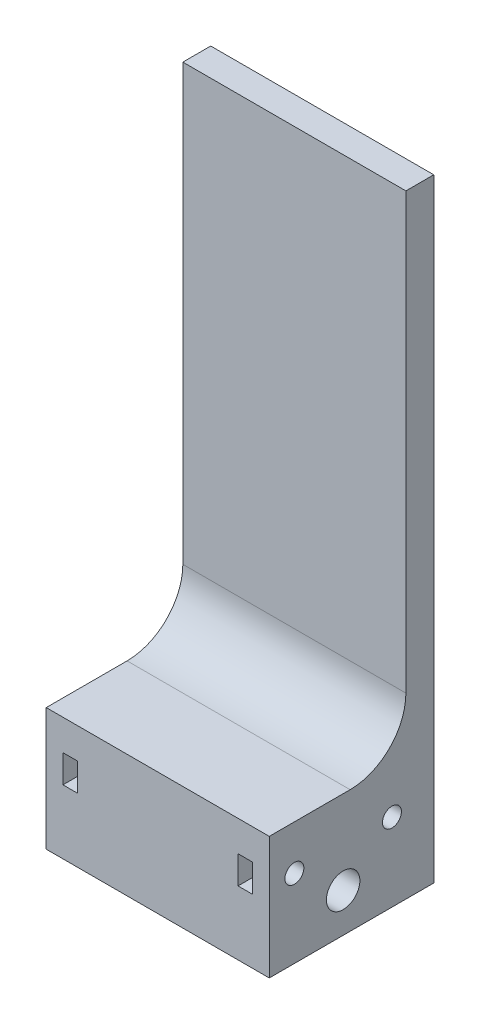
ISO-10303-21;
HEADER;
FILE_DESCRIPTION(('STEP AP214'),'2;1');
FILE_NAME('part.step','',(''),(''),'','','');
FILE_SCHEMA(('AUTOMOTIVE_DESIGN { 1 0 10303 214 1 1 1 1 }'));
ENDSEC;
DATA;
#1=APPLICATION_CONTEXT('core data for automotive mechanical design processes');
#2=APPLICATION_PROTOCOL_DEFINITION('international standard','automotive_design',2000,#1);
#3=PRODUCT_CONTEXT('',#1,'mechanical');
#4=PRODUCT('Part','Part','',(#3));
#5=PRODUCT_RELATED_PRODUCT_CATEGORY('part','',(#4));
#6=PRODUCT_DEFINITION_FORMATION('','',#4);
#7=PRODUCT_DEFINITION_CONTEXT('part definition',#1,'design');
#8=PRODUCT_DEFINITION('design','',#6,#7);
#9=PRODUCT_DEFINITION_SHAPE('','',#8);
#10=(LENGTH_UNIT() NAMED_UNIT(*) SI_UNIT(.MILLI.,.METRE.));
#11=(NAMED_UNIT(*) PLANE_ANGLE_UNIT() SI_UNIT($,.RADIAN.));
#12=(NAMED_UNIT(*) SI_UNIT($,.STERADIAN.) SOLID_ANGLE_UNIT());
#13=UNCERTAINTY_MEASURE_WITH_UNIT(LENGTH_MEASURE(1.E-05),#10,'distance_accuracy_value','');
#14=(GEOMETRIC_REPRESENTATION_CONTEXT(3) GLOBAL_UNCERTAINTY_ASSIGNED_CONTEXT((#13)) GLOBAL_UNIT_ASSIGNED_CONTEXT((#10,
#11,#12)) REPRESENTATION_CONTEXT('',''));
#15=CARTESIAN_POINT('',(0.,0.,0.));
#16=DIRECTION('',(0.,0.,1.));
#17=DIRECTION('',(1.,0.,0.));
#18=AXIS2_PLACEMENT_3D('',#15,#16,#17);
#19=CARTESIAN_POINT('',(-133.88700540448,31.,-20.));
#20=DIRECTION('',(1.,0.,0.));
#21=DIRECTION('',(0.,1.,0.));
#22=AXIS2_PLACEMENT_3D('',#19,#20,#21);
#23=CYLINDRICAL_SURFACE('',#22,1.7);
#24=CARTESIAN_POINT('',(-17.,31.,-20.));
#25=DIRECTION('',(-1.,0.,0.));
#26=DIRECTION('',(0.,0.,1.));
#27=AXIS2_PLACEMENT_3D('',#24,#25,#26);
#28=CIRCLE('',#27,1.7);
#29=CARTESIAN_POINT('',(-17.,31.,-18.3));
#30=VERTEX_POINT('',#29);
#31=EDGE_CURVE('E460',#30,#30,#28,.T.);
#32=ORIENTED_EDGE('',*,*,#31,.F.);
#33=EDGE_LOOP('',(#32));
#34=FACE_BOUND('',#33,.T.);
#35=CARTESIAN_POINT('',(-20.,31.,-20.));
#36=DIRECTION('',(1.,0.,0.));
#37=DIRECTION('',(0.,1.,0.));
#38=AXIS2_PLACEMENT_3D('',#35,#36,#37);
#39=CIRCLE('',#38,1.7);
#40=CARTESIAN_POINT('',(-20.,32.7,-20.));
#41=VERTEX_POINT('',#40);
#42=EDGE_CURVE('E372',#41,#41,#39,.T.);
#43=ORIENTED_EDGE('',*,*,#42,.F.);
#44=EDGE_LOOP('',(#43));
#45=FACE_BOUND('',#44,.T.);
#46=ADVANCED_FACE('F39',(#34,#45),#23,.F.);
#47=CARTESIAN_POINT('',(-133.88700540448,31.,-2.5));
#48=DIRECTION('',(1.,0.,0.));
#49=DIRECTION('',(0.,1.,0.));
#50=AXIS2_PLACEMENT_3D('',#47,#48,#49);
#51=CYLINDRICAL_SURFACE('',#50,1.7);
#52=CARTESIAN_POINT('',(17.,31.,-2.5));
#53=DIRECTION('',(1.,0.,0.));
#54=DIRECTION('',(0.,0.,-1.));
#55=AXIS2_PLACEMENT_3D('',#52,#53,#54);
#56=CIRCLE('',#55,1.7);
#57=CARTESIAN_POINT('',(17.,31.,-4.2));
#58=VERTEX_POINT('',#57);
#59=EDGE_CURVE('E451',#58,#58,#56,.T.);
#60=ORIENTED_EDGE('',*,*,#59,.F.);
#61=EDGE_LOOP('',(#60));
#62=FACE_BOUND('',#61,.T.);
#63=CARTESIAN_POINT('',(20.,31.,-2.5));
#64=DIRECTION('',(-1.,0.,0.));
#65=DIRECTION('',(0.,-1.,0.));
#66=AXIS2_PLACEMENT_3D('',#63,#64,#65);
#67=CIRCLE('',#66,1.7);
#68=CARTESIAN_POINT('',(20.,29.3,-2.5));
#69=VERTEX_POINT('',#68);
#70=EDGE_CURVE('E400',#69,#69,#67,.T.);
#71=ORIENTED_EDGE('',*,*,#70,.F.);
#72=EDGE_LOOP('',(#71));
#73=FACE_BOUND('',#72,.T.);
#74=ADVANCED_FACE('F495',(#62,#73),#51,.F.);
#75=CARTESIAN_POINT('',(20.,0.,0.));
#76=DIRECTION('',(-1.,0.,0.));
#77=DIRECTION('',(0.,-1.,0.));
#78=AXIS2_PLACEMENT_3D('',#75,#76,#77);
#79=PLANE('',#78);
#80=DIRECTION('',(0.,1.,0.));
#81=VECTOR('',#80,1.);
#82=CARTESIAN_POINT('',(20.,17.,2.));
#83=LINE('',#82,#81);
#84=CARTESIAN_POINT('',(20.,17.,2.));
#85=VERTEX_POINT('',#84);
#86=CARTESIAN_POINT('',(20.,39.,2.));
#87=VERTEX_POINT('',#86);
#88=EDGE_CURVE('E392',#85,#87,#83,.T.);
#89=ORIENTED_EDGE('',*,*,#88,.F.);
#90=DIRECTION('',(0.,0.,1.));
#91=VECTOR('',#90,1.);
#92=CARTESIAN_POINT('',(20.,17.,2.));
#93=LINE('',#92,#91);
#94=CARTESIAN_POINT('',(20.,17.,-27.5));
#95=VERTEX_POINT('',#94);
#96=EDGE_CURVE('E369',#95,#85,#93,.T.);
#97=ORIENTED_EDGE('',*,*,#96,.F.);
#98=DIRECTION('',(0.,-1.,0.));
#99=VECTOR('',#98,1.);
#100=CARTESIAN_POINT('',(20.,17.,-27.5));
#101=LINE('',#100,#99);
#102=CARTESIAN_POINT('',(20.,127.,-27.5));
#103=VERTEX_POINT('',#102);
#104=EDGE_CURVE('E374',#103,#95,#101,.T.);
#105=ORIENTED_EDGE('',*,*,#104,.F.);
#106=DIRECTION('',(0.,0.,-1.));
#107=VECTOR('',#106,1.);
#108=CARTESIAN_POINT('',(20.,127.,-22.5));
#109=LINE('',#108,#107);
#110=CARTESIAN_POINT('',(20.,127.,-22.5));
#111=VERTEX_POINT('',#110);
#112=EDGE_CURVE('E379',#111,#103,#109,.T.);
#113=ORIENTED_EDGE('',*,*,#112,.F.);
#114=DIRECTION('',(0.,1.,0.));
#115=VECTOR('',#114,1.);
#116=CARTESIAN_POINT('',(20.,127.,-22.5));
#117=LINE('',#116,#115);
#118=CARTESIAN_POINT('',(20.,49.,-22.5));
#119=VERTEX_POINT('',#118);
#120=EDGE_CURVE('E384',#119,#111,#117,.T.);
#121=ORIENTED_EDGE('',*,*,#120,.F.);
#122=CARTESIAN_POINT('',(20.,49.,-12.5));
#123=DIRECTION('',(-1.,0.,0.));
#124=DIRECTION('',(0.,-1.,0.));
#125=AXIS2_PLACEMENT_3D('',#122,#123,#124);
#126=CIRCLE('',#125,10.);
#127=CARTESIAN_POINT('',(20.,39.,-12.5));
#128=VERTEX_POINT('',#127);
#129=EDGE_CURVE('E48',#119,#128,#126,.T.);
#130=ORIENTED_EDGE('',*,*,#129,.T.);
#131=DIRECTION('',(0.,0.,-1.));
#132=VECTOR('',#131,1.);
#133=CARTESIAN_POINT('',(20.,39.,2.));
#134=LINE('',#133,#132);
#135=EDGE_CURVE('E388',#87,#128,#134,.T.);
#136=ORIENTED_EDGE('',*,*,#135,.F.);
#137=EDGE_LOOP('',(#89,#97,#105,#113,#121,#130,#136));
#138=FACE_BOUND('',#137,.T.);
#139=CARTESIAN_POINT('',(20.,24.,-11.25));
#140=DIRECTION('',(-1.,0.,0.));
#141=DIRECTION('',(0.,-1.,0.));
#142=AXIS2_PLACEMENT_3D('',#139,#140,#141);
#143=CIRCLE('',#142,3.);
#144=CARTESIAN_POINT('',(20.,21.,-11.25));
#145=VERTEX_POINT('',#144);
#146=EDGE_CURVE('E397',#145,#145,#143,.T.);
#147=ORIENTED_EDGE('',*,*,#146,.T.);
#148=EDGE_LOOP('',(#147));
#149=FACE_BOUND('',#148,.T.);
#150=ORIENTED_EDGE('',*,*,#70,.T.);
#151=EDGE_LOOP('',(#150));
#152=FACE_BOUND('',#151,.T.);
#153=CARTESIAN_POINT('',(20.,31.,-20.));
#154=DIRECTION('',(-1.,0.,0.));
#155=DIRECTION('',(0.,-1.,0.));
#156=AXIS2_PLACEMENT_3D('',#153,#154,#155);
#157=CIRCLE('',#156,1.7);
#158=CARTESIAN_POINT('',(20.,29.3,-20.));
#159=VERTEX_POINT('',#158);
#160=EDGE_CURVE('E404',#159,#159,#157,.T.);
#161=ORIENTED_EDGE('',*,*,#160,.T.);
#162=EDGE_LOOP('',(#161));
#163=FACE_BOUND('',#162,.T.);
#164=ADVANCED_FACE('F500',(#138,#149,#152,#163),#79,.F.);
#165=CARTESIAN_POINT('',(-133.88700540448,17.,2.));
#166=DIRECTION('',(0.,0.,-1.));
#167=DIRECTION('',(-1.,0.,0.));
#168=AXIS2_PLACEMENT_3D('',#165,#166,#167);
#169=PLANE('',#168);
#170=DIRECTION('',(1.,0.,0.));
#171=VECTOR('',#170,1.);
#172=CARTESIAN_POINT('',(14.4,28.5,2.));
#173=LINE('',#172,#171);
#174=CARTESIAN_POINT('',(14.4,28.5,2.));
#175=VERTEX_POINT('',#174);
#176=CARTESIAN_POINT('',(17.,28.5,2.));
#177=VERTEX_POINT('',#176);
#178=EDGE_CURVE('E309',#175,#177,#173,.T.);
#179=ORIENTED_EDGE('',*,*,#178,.F.);
#180=DIRECTION('',(0.,-1.,0.));
#181=VECTOR('',#180,1.);
#182=CARTESIAN_POINT('',(14.4,33.5,2.));
#183=LINE('',#182,#181);
#184=CARTESIAN_POINT('',(14.4,33.5,2.));
#185=VERTEX_POINT('',#184);
#186=EDGE_CURVE('E307',#185,#175,#183,.T.);
#187=ORIENTED_EDGE('',*,*,#186,.F.);
#188=DIRECTION('',(-1.,0.,0.));
#189=VECTOR('',#188,1.);
#190=CARTESIAN_POINT('',(14.4,33.5,2.));
#191=LINE('',#190,#189);
#192=CARTESIAN_POINT('',(17.,33.5,2.));
#193=VERTEX_POINT('',#192);
#194=EDGE_CURVE('E297',#193,#185,#191,.T.);
#195=ORIENTED_EDGE('',*,*,#194,.F.);
#196=DIRECTION('',(0.,1.,0.));
#197=VECTOR('',#196,1.);
#198=CARTESIAN_POINT('',(17.,33.5,2.));
#199=LINE('',#198,#197);
#200=EDGE_CURVE('E313',#177,#193,#199,.T.);
#201=ORIENTED_EDGE('',*,*,#200,.F.);
#202=EDGE_LOOP('',(#179,#187,#195,#201));
#203=FACE_BOUND('',#202,.T.);
#204=DIRECTION('',(-1.,0.,0.));
#205=VECTOR('',#204,1.);
#206=CARTESIAN_POINT('',(-14.4,33.5,2.));
#207=LINE('',#206,#205);
#208=CARTESIAN_POINT('',(-14.4,33.5,2.));
#209=VERTEX_POINT('',#208);
#210=CARTESIAN_POINT('',(-17.,33.5,2.));
#211=VERTEX_POINT('',#210);
#212=EDGE_CURVE('E348',#209,#211,#207,.T.);
#213=ORIENTED_EDGE('',*,*,#212,.F.);
#214=DIRECTION('',(0.,1.,0.));
#215=VECTOR('',#214,1.);
#216=CARTESIAN_POINT('',(-14.4,33.5,2.));
#217=LINE('',#216,#215);
#218=CARTESIAN_POINT('',(-14.4,28.5,2.));
#219=VERTEX_POINT('',#218);
#220=EDGE_CURVE('E345',#219,#209,#217,.T.);
#221=ORIENTED_EDGE('',*,*,#220,.F.);
#222=DIRECTION('',(1.,0.,0.));
#223=VECTOR('',#222,1.);
#224=CARTESIAN_POINT('',(-14.4,28.5,2.));
#225=LINE('',#224,#223);
#226=CARTESIAN_POINT('',(-17.,28.5,2.));
#227=VERTEX_POINT('',#226);
#228=EDGE_CURVE('E332',#227,#219,#225,.T.);
#229=ORIENTED_EDGE('',*,*,#228,.F.);
#230=DIRECTION('',(0.,-1.,0.));
#231=VECTOR('',#230,1.);
#232=CARTESIAN_POINT('',(-17.,33.5,2.));
#233=LINE('',#232,#231);
#234=EDGE_CURVE('E352',#211,#227,#233,.T.);
#235=ORIENTED_EDGE('',*,*,#234,.F.);
#236=EDGE_LOOP('',(#213,#221,#229,#235));
#237=FACE_BOUND('',#236,.T.);
#238=DIRECTION('',(1.,0.,0.));
#239=VECTOR('',#238,1.);
#240=CARTESIAN_POINT('',(-133.88700540448,39.,2.));
#241=LINE('',#240,#239);
#242=CARTESIAN_POINT('',(-20.,39.,2.));
#243=VERTEX_POINT('',#242);
#244=EDGE_CURVE('E391',#243,#87,#241,.T.);
#245=ORIENTED_EDGE('',*,*,#244,.F.);
#246=DIRECTION('',(0.,-1.,0.));
#247=VECTOR('',#246,1.);
#248=CARTESIAN_POINT('',(-20.,17.,2.));
#249=LINE('',#248,#247);
#250=CARTESIAN_POINT('',(-20.,17.,2.));
#251=VERTEX_POINT('',#250);
#252=EDGE_CURVE('E407',#243,#251,#249,.T.);
#253=ORIENTED_EDGE('',*,*,#252,.T.);
#254=DIRECTION('',(1.,0.,0.));
#255=VECTOR('',#254,1.);
#256=CARTESIAN_POINT('',(-133.88700540448,17.,2.));
#257=LINE('',#256,#255);
#258=EDGE_CURVE('E396',#251,#85,#257,.T.);
#259=ORIENTED_EDGE('',*,*,#258,.T.);
#260=ORIENTED_EDGE('',*,*,#88,.T.);
#261=EDGE_LOOP('',(#245,#253,#259,#260));
#262=FACE_BOUND('',#261,.T.);
#263=ADVANCED_FACE('F521',(#203,#237,#262),#169,.F.);
#264=CARTESIAN_POINT('',(-133.88700540448,39.,2.));
#265=DIRECTION('',(0.,-1.,0.));
#266=DIRECTION('',(1.,0.,0.));
#267=AXIS2_PLACEMENT_3D('',#264,#265,#266);
#268=PLANE('',#267);
#269=ORIENTED_EDGE('',*,*,#135,.T.);
#270=DIRECTION('',(1.,0.,0.));
#271=VECTOR('',#270,1.);
#272=CARTESIAN_POINT('',(-20.,39.,-12.5));
#273=LINE('',#272,#271);
#274=CARTESIAN_POINT('',(-20.,39.,-12.5));
#275=VERTEX_POINT('',#274);
#276=EDGE_CURVE('E441',#128,#275,#273,.F.);
#277=ORIENTED_EDGE('',*,*,#276,.T.);
#278=DIRECTION('',(0.,0.,1.));
#279=VECTOR('',#278,1.);
#280=CARTESIAN_POINT('',(-20.,39.,2.));
#281=LINE('',#280,#279);
#282=EDGE_CURVE('E395',#275,#243,#281,.T.);
#283=ORIENTED_EDGE('',*,*,#282,.T.);
#284=ORIENTED_EDGE('',*,*,#244,.T.);
#285=EDGE_LOOP('',(#269,#277,#283,#284));
#286=FACE_BOUND('',#285,.T.);
#287=ADVANCED_FACE('F527',(#286),#268,.F.);
#288=CARTESIAN_POINT('',(-133.88700540448,127.,-22.5));
#289=DIRECTION('',(0.,0.,-1.));
#290=DIRECTION('',(0.,1.,0.));
#291=AXIS2_PLACEMENT_3D('',#288,#289,#290);
#292=PLANE('',#291);
#293=DIRECTION('',(0.,-1.,0.));
#294=VECTOR('',#293,1.);
#295=CARTESIAN_POINT('',(-20.,127.,-22.5));
#296=LINE('',#295,#294);
#297=CARTESIAN_POINT('',(-20.,127.,-22.5));
#298=VERTEX_POINT('',#297);
#299=CARTESIAN_POINT('',(-20.,49.,-22.5));
#300=VERTEX_POINT('',#299);
#301=EDGE_CURVE('E387',#298,#300,#296,.T.);
#302=ORIENTED_EDGE('',*,*,#301,.T.);
#303=DIRECTION('',(1.,0.,0.));
#304=VECTOR('',#303,1.);
#305=CARTESIAN_POINT('',(20.,49.,-22.5));
#306=LINE('',#305,#304);
#307=EDGE_CURVE('E431',#300,#119,#306,.T.);
#308=ORIENTED_EDGE('',*,*,#307,.T.);
#309=ORIENTED_EDGE('',*,*,#120,.T.);
#310=DIRECTION('',(1.,0.,0.));
#311=VECTOR('',#310,1.);
#312=CARTESIAN_POINT('',(-133.88700540448,127.,-22.5));
#313=LINE('',#312,#311);
#314=EDGE_CURVE('E383',#298,#111,#313,.T.);
#315=ORIENTED_EDGE('',*,*,#314,.F.);
#316=EDGE_LOOP('',(#302,#308,#309,#315));
#317=FACE_BOUND('',#316,.T.);
#318=ADVANCED_FACE('F550',(#317),#292,.F.);
#319=CARTESIAN_POINT('',(-133.88700540448,127.,-22.5));
#320=DIRECTION('',(0.,-1.,0.));
#321=DIRECTION('',(1.,0.,0.));
#322=AXIS2_PLACEMENT_3D('',#319,#320,#321);
#323=PLANE('',#322);
#324=DIRECTION('',(1.,0.,0.));
#325=VECTOR('',#324,1.);
#326=CARTESIAN_POINT('',(-133.88700540448,127.,-27.5));
#327=LINE('',#326,#325);
#328=CARTESIAN_POINT('',(-20.,127.,-27.5));
#329=VERTEX_POINT('',#328);
#330=EDGE_CURVE('E378',#329,#103,#327,.T.);
#331=ORIENTED_EDGE('',*,*,#330,.F.);
#332=DIRECTION('',(0.,0.,1.));
#333=VECTOR('',#332,1.);
#334=CARTESIAN_POINT('',(-20.,127.,-22.5));
#335=LINE('',#334,#333);
#336=EDGE_CURVE('E386',#329,#298,#335,.T.);
#337=ORIENTED_EDGE('',*,*,#336,.T.);
#338=ORIENTED_EDGE('',*,*,#314,.T.);
#339=ORIENTED_EDGE('',*,*,#112,.T.);
#340=EDGE_LOOP('',(#331,#337,#338,#339));
#341=FACE_BOUND('',#340,.T.);
#342=ADVANCED_FACE('F546',(#341),#323,.F.);
#343=CARTESIAN_POINT('',(-133.88700540448,17.,-27.5));
#344=DIRECTION('',(0.,0.,1.));
#345=DIRECTION('',(0.,-1.,0.));
#346=AXIS2_PLACEMENT_3D('',#343,#344,#345);
#347=PLANE('',#346);
#348=DIRECTION('',(-1.,0.,0.));
#349=VECTOR('',#348,1.);
#350=CARTESIAN_POINT('',(-14.4,28.5,-27.5));
#351=LINE('',#350,#349);
#352=CARTESIAN_POINT('',(-14.4,28.5,-27.5));
#353=VERTEX_POINT('',#352);
#354=CARTESIAN_POINT('',(-17.,28.5,-27.5));
#355=VERTEX_POINT('',#354);
#356=EDGE_CURVE('E248',#353,#355,#351,.T.);
#357=ORIENTED_EDGE('',*,*,#356,.F.);
#358=DIRECTION('',(0.,-1.,0.));
#359=VECTOR('',#358,1.);
#360=CARTESIAN_POINT('',(-14.4,33.5,-27.5));
#361=LINE('',#360,#359);
#362=CARTESIAN_POINT('',(-14.4,33.5,-27.5));
#363=VERTEX_POINT('',#362);
#364=EDGE_CURVE('E59',#363,#353,#361,.T.);
#365=ORIENTED_EDGE('',*,*,#364,.F.);
#366=DIRECTION('',(1.,0.,0.));
#367=VECTOR('',#366,1.);
#368=CARTESIAN_POINT('',(-17.,33.5,-27.5));
#369=LINE('',#368,#367);
#370=CARTESIAN_POINT('',(-17.,33.5,-27.5));
#371=VERTEX_POINT('',#370);
#372=EDGE_CURVE('E234',#371,#363,#369,.T.);
#373=ORIENTED_EDGE('',*,*,#372,.F.);
#374=DIRECTION('',(0.,1.,0.));
#375=VECTOR('',#374,1.);
#376=CARTESIAN_POINT('',(-17.,28.5,-27.5));
#377=LINE('',#376,#375);
#378=EDGE_CURVE('E239',#355,#371,#377,.T.);
#379=ORIENTED_EDGE('',*,*,#378,.F.);
#380=EDGE_LOOP('',(#357,#365,#373,#379));
#381=FACE_BOUND('',#380,.T.);
#382=DIRECTION('',(1.,0.,0.));
#383=VECTOR('',#382,1.);
#384=CARTESIAN_POINT('',(14.4,33.5,-27.5));
#385=LINE('',#384,#383);
#386=CARTESIAN_POINT('',(14.4,33.5,-27.5));
#387=VERTEX_POINT('',#386);
#388=CARTESIAN_POINT('',(17.,33.5,-27.5));
#389=VERTEX_POINT('',#388);
#390=EDGE_CURVE('E279',#387,#389,#385,.T.);
#391=ORIENTED_EDGE('',*,*,#390,.F.);
#392=DIRECTION('',(0.,1.,0.));
#393=VECTOR('',#392,1.);
#394=CARTESIAN_POINT('',(14.4,28.5,-27.5));
#395=LINE('',#394,#393);
#396=CARTESIAN_POINT('',(14.4,28.5,-27.5));
#397=VERTEX_POINT('',#396);
#398=EDGE_CURVE('E67',#397,#387,#395,.T.);
#399=ORIENTED_EDGE('',*,*,#398,.F.);
#400=DIRECTION('',(-1.,0.,0.));
#401=VECTOR('',#400,1.);
#402=CARTESIAN_POINT('',(17.,28.5,-27.5));
#403=LINE('',#402,#401);
#404=CARTESIAN_POINT('',(17.,28.5,-27.5));
#405=VERTEX_POINT('',#404);
#406=EDGE_CURVE('E268',#405,#397,#403,.T.);
#407=ORIENTED_EDGE('',*,*,#406,.F.);
#408=DIRECTION('',(0.,-1.,0.));
#409=VECTOR('',#408,1.);
#410=CARTESIAN_POINT('',(17.,33.5,-27.5));
#411=LINE('',#410,#409);
#412=EDGE_CURVE('E282',#389,#405,#411,.T.);
#413=ORIENTED_EDGE('',*,*,#412,.F.);
#414=EDGE_LOOP('',(#391,#399,#407,#413));
#415=FACE_BOUND('',#414,.T.);
#416=DIRECTION('',(1.,0.,0.));
#417=VECTOR('',#416,1.);
#418=CARTESIAN_POINT('',(-133.88700540448,17.,-27.5));
#419=LINE('',#418,#417);
#420=CARTESIAN_POINT('',(-20.,17.,-27.5));
#421=VERTEX_POINT('',#420);
#422=EDGE_CURVE('E373',#421,#95,#419,.T.);
#423=ORIENTED_EDGE('',*,*,#422,.F.);
#424=DIRECTION('',(0.,1.,0.));
#425=VECTOR('',#424,1.);
#426=CARTESIAN_POINT('',(-20.,17.,-27.5));
#427=LINE('',#426,#425);
#428=EDGE_CURVE('E382',#421,#329,#427,.T.);
#429=ORIENTED_EDGE('',*,*,#428,.T.);
#430=ORIENTED_EDGE('',*,*,#330,.T.);
#431=ORIENTED_EDGE('',*,*,#104,.T.);
#432=EDGE_LOOP('',(#423,#429,#430,#431));
#433=FACE_BOUND('',#432,.T.);
#434=ADVANCED_FACE('F542',(#381,#415,#433),#347,.F.);
#435=CARTESIAN_POINT('',(-133.88700540448,17.,2.));
#436=DIRECTION('',(0.,1.,0.));
#437=DIRECTION('',(-1.,0.,0.));
#438=AXIS2_PLACEMENT_3D('',#435,#436,#437);
#439=PLANE('',#438);
#440=ORIENTED_EDGE('',*,*,#258,.F.);
#441=DIRECTION('',(0.,0.,-1.));
#442=VECTOR('',#441,1.);
#443=CARTESIAN_POINT('',(-20.,17.,2.));
#444=LINE('',#443,#442);
#445=EDGE_CURVE('E377',#251,#421,#444,.T.);
#446=ORIENTED_EDGE('',*,*,#445,.T.);
#447=ORIENTED_EDGE('',*,*,#422,.T.);
#448=ORIENTED_EDGE('',*,*,#96,.T.);
#449=EDGE_LOOP('',(#440,#446,#447,#448));
#450=FACE_BOUND('',#449,.T.);
#451=ADVANCED_FACE('F538',(#450),#439,.F.);
#452=CARTESIAN_POINT('',(-133.88700540448,24.,-11.25));
#453=DIRECTION('',(1.,0.,0.));
#454=DIRECTION('',(0.,1.,0.));
#455=AXIS2_PLACEMENT_3D('',#452,#453,#454);
#456=CYLINDRICAL_SURFACE('',#455,3.);
#457=CARTESIAN_POINT('',(-20.,24.,-11.25));
#458=DIRECTION('',(1.,0.,0.));
#459=DIRECTION('',(0.,1.,0.));
#460=AXIS2_PLACEMENT_3D('',#457,#458,#459);
#461=CIRCLE('',#460,3.);
#462=CARTESIAN_POINT('',(-20.,27.,-11.25));
#463=VERTEX_POINT('',#462);
#464=EDGE_CURVE('E427',#463,#463,#461,.T.);
#465=ORIENTED_EDGE('',*,*,#464,.F.);
#466=EDGE_LOOP('',(#465));
#467=FACE_BOUND('',#466,.T.);
#468=ORIENTED_EDGE('',*,*,#146,.F.);
#469=EDGE_LOOP('',(#468));
#470=FACE_BOUND('',#469,.T.);
#471=ADVANCED_FACE('F514',(#467,#470),#456,.F.);
#472=CARTESIAN_POINT('',(-17.,31.,-2.5));
#473=DIRECTION('',(-1.,0.,0.));
#474=DIRECTION('',(0.,0.,1.));
#475=AXIS2_PLACEMENT_3D('',#472,#473,#474);
#476=CIRCLE('',#475,1.7);
#477=CARTESIAN_POINT('',(-17.,31.,-0.799999999999996));
#478=VERTEX_POINT('',#477);
#479=EDGE_CURVE('E320',#478,#478,#476,.T.);
#480=ORIENTED_EDGE('',*,*,#479,.F.);
#481=EDGE_LOOP('',(#480));
#482=FACE_BOUND('',#481,.T.);
#483=CARTESIAN_POINT('',(-20.,31.,-2.5));
#484=DIRECTION('',(1.,0.,0.));
#485=DIRECTION('',(0.,1.,0.));
#486=AXIS2_PLACEMENT_3D('',#483,#484,#485);
#487=CIRCLE('',#486,1.7);
#488=CARTESIAN_POINT('',(-20.,32.7,-2.5));
#489=VERTEX_POINT('',#488);
#490=EDGE_CURVE('E432',#489,#489,#487,.T.);
#491=ORIENTED_EDGE('',*,*,#490,.F.);
#492=EDGE_LOOP('',(#491));
#493=FACE_BOUND('',#492,.T.);
#494=ADVANCED_FACE('F503',(#482,#493),#51,.F.);
#495=CARTESIAN_POINT('',(17.,31.,-20.));
#496=DIRECTION('',(1.,0.,0.));
#497=DIRECTION('',(0.,0.,-1.));
#498=AXIS2_PLACEMENT_3D('',#495,#496,#497);
#499=CIRCLE('',#498,1.7);
#500=CARTESIAN_POINT('',(17.,31.,-21.7));
#501=VERTEX_POINT('',#500);
#502=EDGE_CURVE('E258',#501,#501,#499,.T.);
#503=ORIENTED_EDGE('',*,*,#502,.F.);
#504=EDGE_LOOP('',(#503));
#505=FACE_BOUND('',#504,.T.);
#506=ORIENTED_EDGE('',*,*,#160,.F.);
#507=EDGE_LOOP('',(#506));
#508=FACE_BOUND('',#507,.T.);
#509=ADVANCED_FACE('F475',(#505,#508),#23,.F.);
#510=CARTESIAN_POINT('',(-20.,37.,-11.25));
#511=DIRECTION('',(1.,0.,0.));
#512=DIRECTION('',(0.,0.,1.));
#513=AXIS2_PLACEMENT_3D('',#510,#511,#512);
#514=PLANE('',#513);
#515=ORIENTED_EDGE('',*,*,#42,.T.);
#516=EDGE_LOOP('',(#515));
#517=FACE_BOUND('',#516,.T.);
#518=ORIENTED_EDGE('',*,*,#490,.T.);
#519=EDGE_LOOP('',(#518));
#520=FACE_BOUND('',#519,.T.);
#521=ORIENTED_EDGE('',*,*,#464,.T.);
#522=EDGE_LOOP('',(#521));
#523=FACE_BOUND('',#522,.T.);
#524=ORIENTED_EDGE('',*,*,#282,.F.);
#525=CARTESIAN_POINT('',(-20.,49.,-12.5));
#526=DIRECTION('',(1.,0.,0.));
#527=DIRECTION('',(0.,1.,0.));
#528=AXIS2_PLACEMENT_3D('',#525,#526,#527);
#529=CIRCLE('',#528,10.);
#530=EDGE_CURVE('E11',#275,#300,#529,.T.);
#531=ORIENTED_EDGE('',*,*,#530,.T.);
#532=ORIENTED_EDGE('',*,*,#301,.F.);
#533=ORIENTED_EDGE('',*,*,#336,.F.);
#534=ORIENTED_EDGE('',*,*,#428,.F.);
#535=ORIENTED_EDGE('',*,*,#445,.F.);
#536=ORIENTED_EDGE('',*,*,#252,.F.);
#537=EDGE_LOOP('',(#524,#531,#532,#533,#534,#535,#536));
#538=FACE_BOUND('',#537,.T.);
#539=ADVANCED_FACE('F507',(#517,#520,#523,#538),#514,.F.);
#540=CARTESIAN_POINT('',(-133.88700540448,49.,-12.5));
#541=DIRECTION('',(-1.,0.,0.));
#542=DIRECTION('',(0.,-1.,0.));
#543=AXIS2_PLACEMENT_3D('',#540,#541,#542);
#544=CYLINDRICAL_SURFACE('',#543,10.);
#545=ORIENTED_EDGE('',*,*,#530,.F.);
#546=ORIENTED_EDGE('',*,*,#276,.F.);
#547=ORIENTED_EDGE('',*,*,#129,.F.);
#548=ORIENTED_EDGE('',*,*,#307,.F.);
#549=EDGE_LOOP('',(#545,#546,#547,#548));
#550=FACE_BOUND('',#549,.T.);
#551=ADVANCED_FACE('F41',(#550),#544,.F.);
#552=CARTESIAN_POINT('',(-14.4,33.5,-5.));
#553=DIRECTION('',(1.,0.,0.));
#554=DIRECTION('',(0.,0.,-1.));
#555=AXIS2_PLACEMENT_3D('',#552,#553,#554);
#556=PLANE('',#555);
#557=CARTESIAN_POINT('',(-14.4,31.,-2.5));
#558=DIRECTION('',(1.,0.,0.));
#559=DIRECTION('',(0.,0.,-1.));
#560=AXIS2_PLACEMENT_3D('',#557,#558,#559);
#561=CIRCLE('',#560,1.7);
#562=CARTESIAN_POINT('',(-14.4,31.,-4.2));
#563=VERTEX_POINT('',#562);
#564=EDGE_CURVE('E447',#563,#563,#561,.T.);
#565=ORIENTED_EDGE('',*,*,#564,.T.);
#566=EDGE_LOOP('',(#565));
#567=FACE_BOUND('',#566,.T.);
#568=ORIENTED_EDGE('',*,*,#220,.T.);
#569=DIRECTION('',(0.,0.,1.));
#570=VECTOR('',#569,1.);
#571=CARTESIAN_POINT('',(-14.4,33.5,-5.));
#572=LINE('',#571,#570);
#573=CARTESIAN_POINT('',(-14.4,33.5,-5.));
#574=VERTEX_POINT('',#573);
#575=EDGE_CURVE('E344',#574,#209,#572,.T.);
#576=ORIENTED_EDGE('',*,*,#575,.F.);
#577=DIRECTION('',(0.,1.,0.));
#578=VECTOR('',#577,1.);
#579=CARTESIAN_POINT('',(-14.4,33.5,-5.));
#580=LINE('',#579,#578);
#581=CARTESIAN_POINT('',(-14.4,28.5,-5.));
#582=VERTEX_POINT('',#581);
#583=EDGE_CURVE('E327',#582,#574,#580,.T.);
#584=ORIENTED_EDGE('',*,*,#583,.F.);
#585=DIRECTION('',(0.,0.,1.));
#586=VECTOR('',#585,1.);
#587=CARTESIAN_POINT('',(-14.4,28.5,-5.));
#588=LINE('',#587,#586);
#589=EDGE_CURVE('E310',#582,#219,#588,.T.);
#590=ORIENTED_EDGE('',*,*,#589,.T.);
#591=EDGE_LOOP('',(#568,#576,#584,#590));
#592=FACE_BOUND('',#591,.T.);
#593=ADVANCED_FACE('F534',(#567,#592),#556,.F.);
#594=CARTESIAN_POINT('',(-14.4,28.5,-5.));
#595=DIRECTION('',(0.,-1.,0.));
#596=DIRECTION('',(0.,0.,-1.));
#597=AXIS2_PLACEMENT_3D('',#594,#595,#596);
#598=PLANE('',#597);
#599=ORIENTED_EDGE('',*,*,#228,.T.);
#600=ORIENTED_EDGE('',*,*,#589,.F.);
#601=DIRECTION('',(1.,0.,0.));
#602=VECTOR('',#601,1.);
#603=CARTESIAN_POINT('',(-14.4,28.5,-5.));
#604=LINE('',#603,#602);
#605=CARTESIAN_POINT('',(-17.,28.5,-5.));
#606=VERTEX_POINT('',#605);
#607=EDGE_CURVE('E340',#606,#582,#604,.T.);
#608=ORIENTED_EDGE('',*,*,#607,.F.);
#609=DIRECTION('',(0.,0.,1.));
#610=VECTOR('',#609,1.);
#611=CARTESIAN_POINT('',(-17.,28.5,-5.));
#612=LINE('',#611,#610);
#613=EDGE_CURVE('E361',#606,#227,#612,.T.);
#614=ORIENTED_EDGE('',*,*,#613,.T.);
#615=EDGE_LOOP('',(#599,#600,#608,#614));
#616=FACE_BOUND('',#615,.T.);
#617=ADVANCED_FACE('F582',(#616),#598,.F.);
#618=CARTESIAN_POINT('',(-17.,33.5,-5.));
#619=DIRECTION('',(-1.,0.,0.));
#620=DIRECTION('',(0.,0.,1.));
#621=AXIS2_PLACEMENT_3D('',#618,#619,#620);
#622=PLANE('',#621);
#623=ORIENTED_EDGE('',*,*,#479,.T.);
#624=EDGE_LOOP('',(#623));
#625=FACE_BOUND('',#624,.T.);
#626=ORIENTED_EDGE('',*,*,#234,.T.);
#627=ORIENTED_EDGE('',*,*,#613,.F.);
#628=DIRECTION('',(0.,-1.,0.));
#629=VECTOR('',#628,1.);
#630=CARTESIAN_POINT('',(-17.,33.5,-5.));
#631=LINE('',#630,#629);
#632=CARTESIAN_POINT('',(-17.,33.5,-5.));
#633=VERTEX_POINT('',#632);
#634=EDGE_CURVE('E336',#633,#606,#631,.T.);
#635=ORIENTED_EDGE('',*,*,#634,.F.);
#636=DIRECTION('',(0.,0.,1.));
#637=VECTOR('',#636,1.);
#638=CARTESIAN_POINT('',(-17.,33.5,-5.));
#639=LINE('',#638,#637);
#640=EDGE_CURVE('E363',#633,#211,#639,.T.);
#641=ORIENTED_EDGE('',*,*,#640,.T.);
#642=EDGE_LOOP('',(#626,#627,#635,#641));
#643=FACE_BOUND('',#642,.T.);
#644=ADVANCED_FACE('F587',(#625,#643),#622,.F.);
#645=CARTESIAN_POINT('',(-14.4,33.5,-5.));
#646=DIRECTION('',(0.,1.,0.));
#647=DIRECTION('',(0.,0.,1.));
#648=AXIS2_PLACEMENT_3D('',#645,#646,#647);
#649=PLANE('',#648);
#650=ORIENTED_EDGE('',*,*,#212,.T.);
#651=ORIENTED_EDGE('',*,*,#640,.F.);
#652=DIRECTION('',(-1.,0.,0.));
#653=VECTOR('',#652,1.);
#654=CARTESIAN_POINT('',(-14.4,33.5,-5.));
#655=LINE('',#654,#653);
#656=EDGE_CURVE('E331',#574,#633,#655,.T.);
#657=ORIENTED_EDGE('',*,*,#656,.F.);
#658=ORIENTED_EDGE('',*,*,#575,.T.);
#659=EDGE_LOOP('',(#650,#651,#657,#658));
#660=FACE_BOUND('',#659,.T.);
#661=ADVANCED_FACE('F599',(#660),#649,.F.);
#662=CARTESIAN_POINT('',(0.,0.,-5.));
#663=DIRECTION('',(0.,0.,-1.));
#664=DIRECTION('',(-1.,0.,0.));
#665=AXIS2_PLACEMENT_3D('',#662,#663,#664);
#666=PLANE('',#665);
#667=ORIENTED_EDGE('',*,*,#583,.T.);
#668=ORIENTED_EDGE('',*,*,#656,.T.);
#669=ORIENTED_EDGE('',*,*,#634,.T.);
#670=ORIENTED_EDGE('',*,*,#607,.T.);
#671=EDGE_LOOP('',(#667,#668,#669,#670));
#672=FACE_BOUND('',#671,.T.);
#673=ADVANCED_FACE('F605',(#672),#666,.F.);
#674=CARTESIAN_POINT('',(14.4,31.,-2.5));
#675=DIRECTION('',(-1.,0.,0.));
#676=DIRECTION('',(0.,0.,1.));
#677=AXIS2_PLACEMENT_3D('',#674,#675,#676);
#678=CIRCLE('',#677,1.7);
#679=CARTESIAN_POINT('',(14.4,31.,-0.799999999999996));
#680=VERTEX_POINT('',#679);
#681=EDGE_CURVE('E401',#680,#680,#678,.T.);
#682=ORIENTED_EDGE('',*,*,#681,.F.);
#683=EDGE_LOOP('',(#682));
#684=FACE_BOUND('',#683,.T.);
#685=ORIENTED_EDGE('',*,*,#564,.F.);
#686=EDGE_LOOP('',(#685));
#687=FACE_BOUND('',#686,.T.);
#688=ADVANCED_FACE('F504',(#684,#687),#51,.F.);
#689=CARTESIAN_POINT('',(14.4,33.5,-5.));
#690=DIRECTION('',(-1.,0.,0.));
#691=DIRECTION('',(0.,0.,1.));
#692=AXIS2_PLACEMENT_3D('',#689,#690,#691);
#693=PLANE('',#692);
#694=ORIENTED_EDGE('',*,*,#681,.T.);
#695=EDGE_LOOP('',(#694));
#696=FACE_BOUND('',#695,.T.);
#697=ORIENTED_EDGE('',*,*,#186,.T.);
#698=DIRECTION('',(0.,0.,1.));
#699=VECTOR('',#698,1.);
#700=CARTESIAN_POINT('',(14.4,28.5,-5.));
#701=LINE('',#700,#699);
#702=CARTESIAN_POINT('',(14.4,28.5,-5.));
#703=VERTEX_POINT('',#702);
#704=EDGE_CURVE('E306',#703,#175,#701,.T.);
#705=ORIENTED_EDGE('',*,*,#704,.F.);
#706=DIRECTION('',(0.,-1.,0.));
#707=VECTOR('',#706,1.);
#708=CARTESIAN_POINT('',(14.4,33.5,-5.));
#709=LINE('',#708,#707);
#710=CARTESIAN_POINT('',(14.4,33.5,-5.));
#711=VERTEX_POINT('',#710);
#712=EDGE_CURVE('E293',#711,#703,#709,.T.);
#713=ORIENTED_EDGE('',*,*,#712,.F.);
#714=DIRECTION('',(0.,0.,1.));
#715=VECTOR('',#714,1.);
#716=CARTESIAN_POINT('',(14.4,33.5,-5.));
#717=LINE('',#716,#715);
#718=EDGE_CURVE('E318',#711,#185,#717,.T.);
#719=ORIENTED_EDGE('',*,*,#718,.T.);
#720=EDGE_LOOP('',(#697,#705,#713,#719));
#721=FACE_BOUND('',#720,.T.);
#722=ADVANCED_FACE('F612',(#696,#721),#693,.F.);
#723=CARTESIAN_POINT('',(14.4,33.5,-5.));
#724=DIRECTION('',(0.,1.,0.));
#725=DIRECTION('',(-1.,0.,0.));
#726=AXIS2_PLACEMENT_3D('',#723,#724,#725);
#727=PLANE('',#726);
#728=ORIENTED_EDGE('',*,*,#194,.T.);
#729=ORIENTED_EDGE('',*,*,#718,.F.);
#730=DIRECTION('',(-1.,0.,0.));
#731=VECTOR('',#730,1.);
#732=CARTESIAN_POINT('',(14.4,33.5,-5.));
#733=LINE('',#732,#731);
#734=CARTESIAN_POINT('',(17.,33.5,-5.));
#735=VERTEX_POINT('',#734);
#736=EDGE_CURVE('E303',#735,#711,#733,.T.);
#737=ORIENTED_EDGE('',*,*,#736,.F.);
#738=DIRECTION('',(0.,0.,1.));
#739=VECTOR('',#738,1.);
#740=CARTESIAN_POINT('',(17.,33.5,-5.));
#741=LINE('',#740,#739);
#742=EDGE_CURVE('E321',#735,#193,#741,.T.);
#743=ORIENTED_EDGE('',*,*,#742,.T.);
#744=EDGE_LOOP('',(#728,#729,#737,#743));
#745=FACE_BOUND('',#744,.T.);
#746=ADVANCED_FACE('F661',(#745),#727,.F.);
#747=CARTESIAN_POINT('',(17.,33.5,-5.));
#748=DIRECTION('',(1.,0.,0.));
#749=DIRECTION('',(0.,0.,-1.));
#750=AXIS2_PLACEMENT_3D('',#747,#748,#749);
#751=PLANE('',#750);
#752=ORIENTED_EDGE('',*,*,#59,.T.);
#753=EDGE_LOOP('',(#752));
#754=FACE_BOUND('',#753,.T.);
#755=ORIENTED_EDGE('',*,*,#200,.T.);
#756=ORIENTED_EDGE('',*,*,#742,.F.);
#757=DIRECTION('',(0.,1.,0.));
#758=VECTOR('',#757,1.);
#759=CARTESIAN_POINT('',(17.,33.5,-5.));
#760=LINE('',#759,#758);
#761=CARTESIAN_POINT('',(17.,28.5,-5.));
#762=VERTEX_POINT('',#761);
#763=EDGE_CURVE('E300',#762,#735,#760,.T.);
#764=ORIENTED_EDGE('',*,*,#763,.F.);
#765=DIRECTION('',(0.,0.,1.));
#766=VECTOR('',#765,1.);
#767=CARTESIAN_POINT('',(17.,28.5,-5.));
#768=LINE('',#767,#766);
#769=EDGE_CURVE('E323',#762,#177,#768,.T.);
#770=ORIENTED_EDGE('',*,*,#769,.T.);
#771=EDGE_LOOP('',(#755,#756,#764,#770));
#772=FACE_BOUND('',#771,.T.);
#773=ADVANCED_FACE('F670',(#754,#772),#751,.F.);
#774=CARTESIAN_POINT('',(14.4,28.5,-5.));
#775=DIRECTION('',(0.,-1.,0.));
#776=DIRECTION('',(1.,0.,0.));
#777=AXIS2_PLACEMENT_3D('',#774,#775,#776);
#778=PLANE('',#777);
#779=ORIENTED_EDGE('',*,*,#178,.T.);
#780=ORIENTED_EDGE('',*,*,#769,.F.);
#781=DIRECTION('',(1.,0.,0.));
#782=VECTOR('',#781,1.);
#783=CARTESIAN_POINT('',(14.4,28.5,-5.));
#784=LINE('',#783,#782);
#785=EDGE_CURVE('E296',#703,#762,#784,.T.);
#786=ORIENTED_EDGE('',*,*,#785,.F.);
#787=ORIENTED_EDGE('',*,*,#704,.T.);
#788=EDGE_LOOP('',(#779,#780,#786,#787));
#789=FACE_BOUND('',#788,.T.);
#790=ADVANCED_FACE('F490',(#789),#778,.F.);
#791=CARTESIAN_POINT('',(0.,0.,-5.));
#792=DIRECTION('',(0.,0.,1.));
#793=DIRECTION('',(1.,0.,0.));
#794=AXIS2_PLACEMENT_3D('',#791,#792,#793);
#795=PLANE('',#794);
#796=ORIENTED_EDGE('',*,*,#712,.T.);
#797=ORIENTED_EDGE('',*,*,#785,.T.);
#798=ORIENTED_EDGE('',*,*,#763,.T.);
#799=ORIENTED_EDGE('',*,*,#736,.T.);
#800=EDGE_LOOP('',(#796,#797,#798,#799));
#801=FACE_BOUND('',#800,.T.);
#802=ADVANCED_FACE('F481',(#801),#795,.T.);
#803=CARTESIAN_POINT('',(14.4,28.5,-16.5));
#804=DIRECTION('',(-1.,0.,0.));
#805=DIRECTION('',(0.,0.,1.));
#806=AXIS2_PLACEMENT_3D('',#803,#804,#805);
#807=PLANE('',#806);
#808=CARTESIAN_POINT('',(14.4,31.,-20.));
#809=DIRECTION('',(-1.,0.,0.));
#810=DIRECTION('',(0.,0.,1.));
#811=AXIS2_PLACEMENT_3D('',#808,#809,#810);
#812=CIRCLE('',#811,1.7);
#813=CARTESIAN_POINT('',(14.4,31.,-18.3));
#814=VERTEX_POINT('',#813);
#815=EDGE_CURVE('E458',#814,#814,#812,.T.);
#816=ORIENTED_EDGE('',*,*,#815,.T.);
#817=EDGE_LOOP('',(#816));
#818=FACE_BOUND('',#817,.T.);
#819=ORIENTED_EDGE('',*,*,#398,.T.);
#820=DIRECTION('',(0.,0.,-1.));
#821=VECTOR('',#820,1.);
#822=CARTESIAN_POINT('',(14.4,33.5,-16.5));
#823=LINE('',#822,#821);
#824=CARTESIAN_POINT('',(14.4,33.5,-16.5));
#825=VERTEX_POINT('',#824);
#826=EDGE_CURVE('E277',#825,#387,#823,.T.);
#827=ORIENTED_EDGE('',*,*,#826,.F.);
#828=DIRECTION('',(0.,1.,0.));
#829=VECTOR('',#828,1.);
#830=CARTESIAN_POINT('',(14.4,28.5,-16.5));
#831=LINE('',#830,#829);
#832=CARTESIAN_POINT('',(14.4,28.5,-16.5));
#833=VERTEX_POINT('',#832);
#834=EDGE_CURVE('E264',#833,#825,#831,.T.);
#835=ORIENTED_EDGE('',*,*,#834,.F.);
#836=DIRECTION('',(0.,0.,-1.));
#837=VECTOR('',#836,1.);
#838=CARTESIAN_POINT('',(14.4,28.5,-16.5));
#839=LINE('',#838,#837);
#840=EDGE_CURVE('E249',#833,#397,#839,.T.);
#841=ORIENTED_EDGE('',*,*,#840,.T.);
#842=EDGE_LOOP('',(#819,#827,#835,#841));
#843=FACE_BOUND('',#842,.T.);
#844=ADVANCED_FACE('F478',(#818,#843),#807,.F.);
#845=CARTESIAN_POINT('',(17.,28.5,-16.5));
#846=DIRECTION('',(0.,-1.,0.));
#847=DIRECTION('',(1.,0.,0.));
#848=AXIS2_PLACEMENT_3D('',#845,#846,#847);
#849=PLANE('',#848);
#850=ORIENTED_EDGE('',*,*,#406,.T.);
#851=ORIENTED_EDGE('',*,*,#840,.F.);
#852=DIRECTION('',(-1.,0.,0.));
#853=VECTOR('',#852,1.);
#854=CARTESIAN_POINT('',(17.,28.5,-16.5));
#855=LINE('',#854,#853);
#856=CARTESIAN_POINT('',(17.,28.5,-16.5));
#857=VERTEX_POINT('',#856);
#858=EDGE_CURVE('E274',#857,#833,#855,.T.);
#859=ORIENTED_EDGE('',*,*,#858,.F.);
#860=DIRECTION('',(0.,0.,-1.));
#861=VECTOR('',#860,1.);
#862=CARTESIAN_POINT('',(17.,28.5,-16.5));
#863=LINE('',#862,#861);
#864=EDGE_CURVE('E288',#857,#405,#863,.T.);
#865=ORIENTED_EDGE('',*,*,#864,.T.);
#866=EDGE_LOOP('',(#850,#851,#859,#865));
#867=FACE_BOUND('',#866,.T.);
#868=ADVANCED_FACE('F480',(#867),#849,.F.);
#869=CARTESIAN_POINT('',(17.,33.5,-16.5));
#870=DIRECTION('',(1.,0.,0.));
#871=DIRECTION('',(0.,0.,-1.));
#872=AXIS2_PLACEMENT_3D('',#869,#870,#871);
#873=PLANE('',#872);
#874=ORIENTED_EDGE('',*,*,#502,.T.);
#875=EDGE_LOOP('',(#874));
#876=FACE_BOUND('',#875,.T.);
#877=ORIENTED_EDGE('',*,*,#412,.T.);
#878=ORIENTED_EDGE('',*,*,#864,.F.);
#879=DIRECTION('',(0.,-1.,0.));
#880=VECTOR('',#879,1.);
#881=CARTESIAN_POINT('',(17.,33.5,-16.5));
#882=LINE('',#881,#880);
#883=CARTESIAN_POINT('',(17.,33.5,-16.5));
#884=VERTEX_POINT('',#883);
#885=EDGE_CURVE('E271',#884,#857,#882,.T.);
#886=ORIENTED_EDGE('',*,*,#885,.F.);
#887=DIRECTION('',(0.,0.,-1.));
#888=VECTOR('',#887,1.);
#889=CARTESIAN_POINT('',(17.,33.5,-16.5));
#890=LINE('',#889,#888);
#891=EDGE_CURVE('E290',#884,#389,#890,.T.);
#892=ORIENTED_EDGE('',*,*,#891,.T.);
#893=EDGE_LOOP('',(#877,#878,#886,#892));
#894=FACE_BOUND('',#893,.T.);
#895=ADVANCED_FACE('F487',(#876,#894),#873,.F.);
#896=CARTESIAN_POINT('',(14.4,33.5,-16.5));
#897=DIRECTION('',(0.,1.,0.));
#898=DIRECTION('',(-1.,0.,0.));
#899=AXIS2_PLACEMENT_3D('',#896,#897,#898);
#900=PLANE('',#899);
#901=ORIENTED_EDGE('',*,*,#390,.T.);
#902=ORIENTED_EDGE('',*,*,#891,.F.);
#903=DIRECTION('',(1.,0.,0.));
#904=VECTOR('',#903,1.);
#905=CARTESIAN_POINT('',(14.4,33.5,-16.5));
#906=LINE('',#905,#904);
#907=EDGE_CURVE('E267',#825,#884,#906,.T.);
#908=ORIENTED_EDGE('',*,*,#907,.F.);
#909=ORIENTED_EDGE('',*,*,#826,.T.);
#910=EDGE_LOOP('',(#901,#902,#908,#909));
#911=FACE_BOUND('',#910,.T.);
#912=ADVANCED_FACE('F733',(#911),#900,.F.);
#913=CARTESIAN_POINT('',(0.,0.,-16.5));
#914=DIRECTION('',(0.,0.,-1.));
#915=DIRECTION('',(-1.,0.,0.));
#916=AXIS2_PLACEMENT_3D('',#913,#914,#915);
#917=PLANE('',#916);
#918=ORIENTED_EDGE('',*,*,#834,.T.);
#919=ORIENTED_EDGE('',*,*,#907,.T.);
#920=ORIENTED_EDGE('',*,*,#885,.T.);
#921=ORIENTED_EDGE('',*,*,#858,.T.);
#922=EDGE_LOOP('',(#918,#919,#920,#921));
#923=FACE_BOUND('',#922,.T.);
#924=ADVANCED_FACE('F473',(#923),#917,.T.);
#925=CARTESIAN_POINT('',(-14.4,31.,-20.));
#926=DIRECTION('',(1.,0.,0.));
#927=DIRECTION('',(0.,0.,-1.));
#928=AXIS2_PLACEMENT_3D('',#925,#926,#927);
#929=CIRCLE('',#928,1.7);
#930=CARTESIAN_POINT('',(-14.4,31.,-21.7));
#931=VERTEX_POINT('',#930);
#932=EDGE_CURVE('E43',#931,#931,#929,.T.);
#933=ORIENTED_EDGE('',*,*,#932,.F.);
#934=EDGE_LOOP('',(#933));
#935=FACE_BOUND('',#934,.T.);
#936=ORIENTED_EDGE('',*,*,#815,.F.);
#937=EDGE_LOOP('',(#936));
#938=FACE_BOUND('',#937,.T.);
#939=ADVANCED_FACE('F470',(#935,#938),#23,.F.);
#940=CARTESIAN_POINT('',(-14.4,33.5,-16.5));
#941=DIRECTION('',(1.,0.,0.));
#942=DIRECTION('',(0.,0.,-1.));
#943=AXIS2_PLACEMENT_3D('',#940,#941,#942);
#944=PLANE('',#943);
#945=ORIENTED_EDGE('',*,*,#932,.T.);
#946=EDGE_LOOP('',(#945));
#947=FACE_BOUND('',#946,.T.);
#948=ORIENTED_EDGE('',*,*,#364,.T.);
#949=DIRECTION('',(0.,0.,-1.));
#950=VECTOR('',#949,1.);
#951=CARTESIAN_POINT('',(-14.4,28.5,-16.5));
#952=LINE('',#951,#950);
#953=CARTESIAN_POINT('',(-14.4,28.5,-16.5));
#954=VERTEX_POINT('',#953);
#955=EDGE_CURVE('E209',#954,#353,#952,.T.);
#956=ORIENTED_EDGE('',*,*,#955,.F.);
#957=DIRECTION('',(0.,-1.,0.));
#958=VECTOR('',#957,1.);
#959=CARTESIAN_POINT('',(-14.4,33.5,-16.5));
#960=LINE('',#959,#958);
#961=CARTESIAN_POINT('',(-14.4,33.5,-16.5));
#962=VERTEX_POINT('',#961);
#963=EDGE_CURVE('E213',#962,#954,#960,.T.);
#964=ORIENTED_EDGE('',*,*,#963,.F.);
#965=DIRECTION('',(0.,0.,-1.));
#966=VECTOR('',#965,1.);
#967=CARTESIAN_POINT('',(-14.4,33.5,-16.5));
#968=LINE('',#967,#966);
#969=EDGE_CURVE('E255',#962,#363,#968,.T.);
#970=ORIENTED_EDGE('',*,*,#969,.T.);
#971=EDGE_LOOP('',(#948,#956,#964,#970));
#972=FACE_BOUND('',#971,.T.);
#973=ADVANCED_FACE('F211',(#947,#972),#944,.F.);
#974=CARTESIAN_POINT('',(-17.,33.5,-16.5));
#975=DIRECTION('',(0.,1.,0.));
#976=DIRECTION('',(0.,0.,1.));
#977=AXIS2_PLACEMENT_3D('',#974,#975,#976);
#978=PLANE('',#977);
#979=ORIENTED_EDGE('',*,*,#372,.T.);
#980=ORIENTED_EDGE('',*,*,#969,.F.);
#981=DIRECTION('',(1.,0.,0.));
#982=VECTOR('',#981,1.);
#983=CARTESIAN_POINT('',(-17.,33.5,-16.5));
#984=LINE('',#983,#982);
#985=CARTESIAN_POINT('',(-17.,33.5,-16.5));
#986=VERTEX_POINT('',#985);
#987=EDGE_CURVE('E220',#986,#962,#984,.T.);
#988=ORIENTED_EDGE('',*,*,#987,.F.);
#989=DIRECTION('',(0.,0.,-1.));
#990=VECTOR('',#989,1.);
#991=CARTESIAN_POINT('',(-17.,33.5,-16.5));
#992=LINE('',#991,#990);
#993=EDGE_CURVE('E259',#986,#371,#992,.T.);
#994=ORIENTED_EDGE('',*,*,#993,.T.);
#995=EDGE_LOOP('',(#979,#980,#988,#994));
#996=FACE_BOUND('',#995,.T.);
#997=ADVANCED_FACE('F765',(#996),#978,.F.);
#998=CARTESIAN_POINT('',(-17.,28.5,-16.5));
#999=DIRECTION('',(-1.,0.,0.));
#1000=DIRECTION('',(0.,0.,1.));
#1001=AXIS2_PLACEMENT_3D('',#998,#999,#1000);
#1002=PLANE('',#1001);
#1003=ORIENTED_EDGE('',*,*,#31,.T.);
#1004=EDGE_LOOP('',(#1003));
#1005=FACE_BOUND('',#1004,.T.);
#1006=ORIENTED_EDGE('',*,*,#378,.T.);
#1007=ORIENTED_EDGE('',*,*,#993,.F.);
#1008=DIRECTION('',(0.,1.,0.));
#1009=VECTOR('',#1008,1.);
#1010=CARTESIAN_POINT('',(-17.,28.5,-16.5));
#1011=LINE('',#1010,#1009);
#1012=CARTESIAN_POINT('',(-17.,28.5,-16.5));
#1013=VERTEX_POINT('',#1012);
#1014=EDGE_CURVE('E229',#1013,#986,#1011,.T.);
#1015=ORIENTED_EDGE('',*,*,#1014,.F.);
#1016=DIRECTION('',(0.,0.,-1.));
#1017=VECTOR('',#1016,1.);
#1018=CARTESIAN_POINT('',(-17.,28.5,-16.5));
#1019=LINE('',#1018,#1017);
#1020=EDGE_CURVE('E219',#1013,#355,#1019,.T.);
#1021=ORIENTED_EDGE('',*,*,#1020,.T.);
#1022=EDGE_LOOP('',(#1006,#1007,#1015,#1021));
#1023=FACE_BOUND('',#1022,.T.);
#1024=ADVANCED_FACE('F774',(#1005,#1023),#1002,.F.);
#1025=CARTESIAN_POINT('',(-14.4,28.5,-16.5));
#1026=DIRECTION('',(0.,-1.,0.));
#1027=DIRECTION('',(0.,0.,-1.));
#1028=AXIS2_PLACEMENT_3D('',#1025,#1026,#1027);
#1029=PLANE('',#1028);
#1030=ORIENTED_EDGE('',*,*,#356,.T.);
#1031=ORIENTED_EDGE('',*,*,#1020,.F.);
#1032=DIRECTION('',(-1.,0.,0.));
#1033=VECTOR('',#1032,1.);
#1034=CARTESIAN_POINT('',(-14.4,28.5,-16.5));
#1035=LINE('',#1034,#1033);
#1036=EDGE_CURVE('E223',#954,#1013,#1035,.T.);
#1037=ORIENTED_EDGE('',*,*,#1036,.F.);
#1038=ORIENTED_EDGE('',*,*,#955,.T.);
#1039=EDGE_LOOP('',(#1030,#1031,#1037,#1038));
#1040=FACE_BOUND('',#1039,.T.);
#1041=ADVANCED_FACE('F224',(#1040),#1029,.F.);
#1042=CARTESIAN_POINT('',(0.,0.,-16.5));
#1043=DIRECTION('',(0.,0.,-1.));
#1044=DIRECTION('',(-1.,0.,0.));
#1045=AXIS2_PLACEMENT_3D('',#1042,#1043,#1044);
#1046=PLANE('',#1045);
#1047=ORIENTED_EDGE('',*,*,#963,.T.);
#1048=ORIENTED_EDGE('',*,*,#1036,.T.);
#1049=ORIENTED_EDGE('',*,*,#1014,.T.);
#1050=ORIENTED_EDGE('',*,*,#987,.T.);
#1051=EDGE_LOOP('',(#1047,#1048,#1049,#1050));
#1052=FACE_BOUND('',#1051,.T.);
#1053=ADVANCED_FACE('F231',(#1052),#1046,.T.);
#1054=CLOSED_SHELL('',(#46,#74,#164,#263,#287,#318,#342,#434,#451,#471,#494,#509,#539,#551,#593,
#617,#644,#661,#673,#688,#722,#746,#773,#790,#802,#844,#868,#895,#912,#924,#939,#973,#997,#1024,
#1041,#1053));
#1055=MANIFOLD_SOLID_BREP('B2',#1054);
#1056=ADVANCED_BREP_SHAPE_REPRESENTATION('',(#18,#1055),#14);
#1057=SHAPE_DEFINITION_REPRESENTATION(#9,#1056);
ENDSEC;
END-ISO-10303-21;
